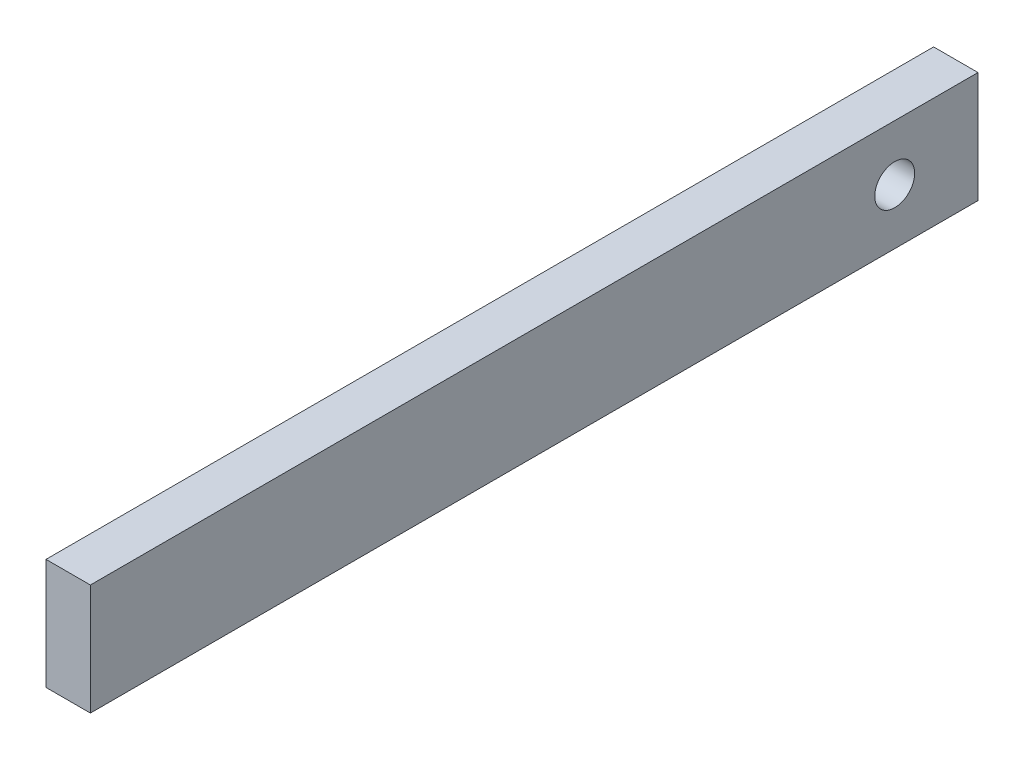
ISO-10303-21;
HEADER;
FILE_DESCRIPTION(('STEP AP214'),'2;1');
FILE_NAME('part.step','',(''),(''),'','','');
FILE_SCHEMA(('AUTOMOTIVE_DESIGN { 1 0 10303 214 1 1 1 1 }'));
ENDSEC;
DATA;
#1=APPLICATION_CONTEXT('core data for automotive mechanical design processes');
#2=APPLICATION_PROTOCOL_DEFINITION('international standard','automotive_design',2000,#1);
#3=PRODUCT_CONTEXT('',#1,'mechanical');
#4=PRODUCT('Part','Part','',(#3));
#5=PRODUCT_RELATED_PRODUCT_CATEGORY('part','',(#4));
#6=PRODUCT_DEFINITION_FORMATION('','',#4);
#7=PRODUCT_DEFINITION_CONTEXT('part definition',#1,'design');
#8=PRODUCT_DEFINITION('design','',#6,#7);
#9=PRODUCT_DEFINITION_SHAPE('','',#8);
#10=(LENGTH_UNIT() NAMED_UNIT(*) SI_UNIT(.MILLI.,.METRE.));
#11=(NAMED_UNIT(*) PLANE_ANGLE_UNIT() SI_UNIT($,.RADIAN.));
#12=(NAMED_UNIT(*) SI_UNIT($,.STERADIAN.) SOLID_ANGLE_UNIT());
#13=UNCERTAINTY_MEASURE_WITH_UNIT(LENGTH_MEASURE(1.E-05),#10,'distance_accuracy_value','');
#14=(GEOMETRIC_REPRESENTATION_CONTEXT(3) GLOBAL_UNCERTAINTY_ASSIGNED_CONTEXT((#13)) GLOBAL_UNIT_ASSIGNED_CONTEXT((#10,
#11,#12)) REPRESENTATION_CONTEXT('',''));
#15=CARTESIAN_POINT('',(0.,0.,0.));
#16=DIRECTION('',(0.,0.,1.));
#17=DIRECTION('',(1.,0.,0.));
#18=AXIS2_PLACEMENT_3D('',#15,#16,#17);
#19=CARTESIAN_POINT('',(20.,0.,0.));
#20=DIRECTION('',(1.,0.,0.));
#21=DIRECTION('',(0.,0.,-1.));
#22=AXIS2_PLACEMENT_3D('',#19,#20,#21);
#23=PLANE('',#22);
#24=DIRECTION('',(0.,-1.,0.));
#25=VECTOR('',#24,1.);
#26=CARTESIAN_POINT('',(20.,51.0263929618768,171.625302136374));
#27=LINE('',#26,#25);
#28=CARTESIAN_POINT('',(20.,51.0263929618768,171.625302136374));
#29=VERTEX_POINT('',#28);
#30=CARTESIAN_POINT('',(20.,1.02639296187682,171.625302136374));
#31=VERTEX_POINT('',#30);
#32=EDGE_CURVE('E91',#29,#31,#27,.T.);
#33=ORIENTED_EDGE('',*,*,#32,.T.);
#34=DIRECTION('',(0.,0.,-1.));
#35=VECTOR('',#34,1.);
#36=CARTESIAN_POINT('',(20.,1.02639296187682,171.625302136374));
#37=LINE('',#36,#35);
#38=CARTESIAN_POINT('',(20.,1.02639296187682,-228.374697863626));
#39=VERTEX_POINT('',#38);
#40=EDGE_CURVE('E86',#31,#39,#37,.T.);
#41=ORIENTED_EDGE('',*,*,#40,.T.);
#42=DIRECTION('',(0.,1.,0.));
#43=VECTOR('',#42,1.);
#44=CARTESIAN_POINT('',(20.,51.0263929618768,-228.374697863626));
#45=LINE('',#44,#43);
#46=CARTESIAN_POINT('',(20.,51.0263929618768,-228.374697863626));
#47=VERTEX_POINT('',#46);
#48=EDGE_CURVE('E89',#39,#47,#45,.T.);
#49=ORIENTED_EDGE('',*,*,#48,.T.);
#50=DIRECTION('',(0.,0.,1.));
#51=VECTOR('',#50,1.);
#52=CARTESIAN_POINT('',(20.,51.0263929618768,171.625302136374));
#53=LINE('',#52,#51);
#54=EDGE_CURVE('E56',#47,#29,#53,.T.);
#55=ORIENTED_EDGE('',*,*,#54,.T.);
#56=EDGE_LOOP('',(#33,#41,#49,#55));
#57=FACE_BOUND('',#56,.T.);
#58=CARTESIAN_POINT('',(20.,26.0263929618768,-190.83804097213));
#59=DIRECTION('',(1.,0.,0.));
#60=DIRECTION('',(0.,0.,-1.));
#61=AXIS2_PLACEMENT_3D('',#58,#59,#60);
#62=CIRCLE('',#61,9.00000000000001);
#63=CARTESIAN_POINT('',(20.,26.0263929618768,-199.83804097213));
#64=VERTEX_POINT('',#63);
#65=EDGE_CURVE('E106',#64,#64,#62,.T.);
#66=ORIENTED_EDGE('',*,*,#65,.F.);
#67=EDGE_LOOP('',(#66));
#68=FACE_BOUND('',#67,.T.);
#69=ADVANCED_FACE('F39',(#57,#68),#23,.T.);
#70=CARTESIAN_POINT('',(0.,0.,0.));
#71=DIRECTION('',(1.,0.,0.));
#72=DIRECTION('',(0.,0.,-1.));
#73=AXIS2_PLACEMENT_3D('',#70,#71,#72);
#74=PLANE('',#73);
#75=DIRECTION('',(0.,-1.,0.));
#76=VECTOR('',#75,1.);
#77=CARTESIAN_POINT('',(0.,51.0263929618768,171.625302136374));
#78=LINE('',#77,#76);
#79=CARTESIAN_POINT('',(0.,51.0263929618768,171.625302136374));
#80=VERTEX_POINT('',#79);
#81=CARTESIAN_POINT('',(0.,1.02639296187682,171.625302136374));
#82=VERTEX_POINT('',#81);
#83=EDGE_CURVE('E103',#80,#82,#78,.T.);
#84=ORIENTED_EDGE('',*,*,#83,.F.);
#85=DIRECTION('',(0.,0.,1.));
#86=VECTOR('',#85,1.);
#87=CARTESIAN_POINT('',(0.,51.0263929618768,171.625302136374));
#88=LINE('',#87,#86);
#89=CARTESIAN_POINT('',(0.,51.0263929618768,-228.374697863626));
#90=VERTEX_POINT('',#89);
#91=EDGE_CURVE('E79',#90,#80,#88,.T.);
#92=ORIENTED_EDGE('',*,*,#91,.F.);
#93=DIRECTION('',(0.,1.,0.));
#94=VECTOR('',#93,1.);
#95=CARTESIAN_POINT('',(0.,51.0263929618768,-228.374697863626));
#96=LINE('',#95,#94);
#97=CARTESIAN_POINT('',(0.,1.02639296187682,-228.374697863626));
#98=VERTEX_POINT('',#97);
#99=EDGE_CURVE('E73',#98,#90,#96,.T.);
#100=ORIENTED_EDGE('',*,*,#99,.F.);
#101=DIRECTION('',(0.,0.,-1.));
#102=VECTOR('',#101,1.);
#103=CARTESIAN_POINT('',(0.,1.02639296187682,171.625302136374));
#104=LINE('',#103,#102);
#105=EDGE_CURVE('E95',#82,#98,#104,.T.);
#106=ORIENTED_EDGE('',*,*,#105,.F.);
#107=EDGE_LOOP('',(#84,#92,#100,#106));
#108=FACE_BOUND('',#107,.T.);
#109=CARTESIAN_POINT('',(0.,26.0263929618768,-190.83804097213));
#110=DIRECTION('',(1.,0.,0.));
#111=DIRECTION('',(0.,0.,-1.));
#112=AXIS2_PLACEMENT_3D('',#109,#110,#111);
#113=CIRCLE('',#112,9.00000000000001);
#114=CARTESIAN_POINT('',(0.,26.0263929618768,-199.83804097213));
#115=VERTEX_POINT('',#114);
#116=EDGE_CURVE('E118',#115,#115,#113,.T.);
#117=ORIENTED_EDGE('',*,*,#116,.T.);
#118=EDGE_LOOP('',(#117));
#119=FACE_BOUND('',#118,.T.);
#120=ADVANCED_FACE('F114',(#108,#119),#74,.F.);
#121=CARTESIAN_POINT('',(20.,51.0263929618768,171.625302136374));
#122=DIRECTION('',(0.,0.,-1.));
#123=DIRECTION('',(-1.,0.,0.));
#124=AXIS2_PLACEMENT_3D('',#121,#122,#123);
#125=PLANE('',#124);
#126=ORIENTED_EDGE('',*,*,#83,.T.);
#127=DIRECTION('',(-1.,0.,0.));
#128=VECTOR('',#127,1.);
#129=CARTESIAN_POINT('',(20.,1.02639296187682,171.625302136374));
#130=LINE('',#129,#128);
#131=EDGE_CURVE('E11',#31,#82,#130,.T.);
#132=ORIENTED_EDGE('',*,*,#131,.F.);
#133=ORIENTED_EDGE('',*,*,#32,.F.);
#134=DIRECTION('',(-1.,0.,0.));
#135=VECTOR('',#134,1.);
#136=CARTESIAN_POINT('',(20.,51.0263929618768,171.625302136374));
#137=LINE('',#136,#135);
#138=EDGE_CURVE('E99',#29,#80,#137,.T.);
#139=ORIENTED_EDGE('',*,*,#138,.T.);
#140=EDGE_LOOP('',(#126,#132,#133,#139));
#141=FACE_BOUND('',#140,.T.);
#142=ADVANCED_FACE('F41',(#141),#125,.F.);
#143=CARTESIAN_POINT('',(20.,1.02639296187682,171.625302136374));
#144=DIRECTION('',(0.,1.,0.));
#145=DIRECTION('',(0.,0.,1.));
#146=AXIS2_PLACEMENT_3D('',#143,#144,#145);
#147=PLANE('',#146);
#148=ORIENTED_EDGE('',*,*,#105,.T.);
#149=DIRECTION('',(-1.,0.,0.));
#150=VECTOR('',#149,1.);
#151=CARTESIAN_POINT('',(20.,1.02639296187682,-228.374697863626));
#152=LINE('',#151,#150);
#153=EDGE_CURVE('E48',#39,#98,#152,.T.);
#154=ORIENTED_EDGE('',*,*,#153,.F.);
#155=ORIENTED_EDGE('',*,*,#40,.F.);
#156=ORIENTED_EDGE('',*,*,#131,.T.);
#157=EDGE_LOOP('',(#148,#154,#155,#156));
#158=FACE_BOUND('',#157,.T.);
#159=ADVANCED_FACE('F94',(#158),#147,.F.);
#160=CARTESIAN_POINT('',(20.,51.0263929618768,-228.374697863626));
#161=DIRECTION('',(0.,0.,1.));
#162=DIRECTION('',(0.,-1.,0.));
#163=AXIS2_PLACEMENT_3D('',#160,#161,#162);
#164=PLANE('',#163);
#165=ORIENTED_EDGE('',*,*,#99,.T.);
#166=DIRECTION('',(-1.,0.,0.));
#167=VECTOR('',#166,1.);
#168=CARTESIAN_POINT('',(20.,51.0263929618768,-228.374697863626));
#169=LINE('',#168,#167);
#170=EDGE_CURVE('E96',#47,#90,#169,.T.);
#171=ORIENTED_EDGE('',*,*,#170,.F.);
#172=ORIENTED_EDGE('',*,*,#48,.F.);
#173=ORIENTED_EDGE('',*,*,#153,.T.);
#174=EDGE_LOOP('',(#165,#171,#172,#173));
#175=FACE_BOUND('',#174,.T.);
#176=ADVANCED_FACE('F97',(#175),#164,.F.);
#177=CARTESIAN_POINT('',(20.,51.0263929618768,171.625302136374));
#178=DIRECTION('',(0.,-1.,0.));
#179=DIRECTION('',(0.,0.,-1.));
#180=AXIS2_PLACEMENT_3D('',#177,#178,#179);
#181=PLANE('',#180);
#182=ORIENTED_EDGE('',*,*,#91,.T.);
#183=ORIENTED_EDGE('',*,*,#138,.F.);
#184=ORIENTED_EDGE('',*,*,#54,.F.);
#185=ORIENTED_EDGE('',*,*,#170,.T.);
#186=EDGE_LOOP('',(#182,#183,#184,#185));
#187=FACE_BOUND('',#186,.T.);
#188=ADVANCED_FACE('F111',(#187),#181,.F.);
#189=CARTESIAN_POINT('',(20.,26.0263929618768,-190.83804097213));
#190=DIRECTION('',(-1.,0.,0.));
#191=DIRECTION('',(0.,0.,1.));
#192=AXIS2_PLACEMENT_3D('',#189,#190,#191);
#193=CYLINDRICAL_SURFACE('',#192,9.00000000000001);
#194=ORIENTED_EDGE('',*,*,#65,.T.);
#195=EDGE_LOOP('',(#194));
#196=FACE_BOUND('',#195,.T.);
#197=ORIENTED_EDGE('',*,*,#116,.F.);
#198=EDGE_LOOP('',(#197));
#199=FACE_BOUND('',#198,.T.);
#200=ADVANCED_FACE('F124',(#196,#199),#193,.F.);
#201=CLOSED_SHELL('',(#69,#120,#142,#159,#176,#188,#200));
#202=MANIFOLD_SOLID_BREP('B2',#201);
#203=ADVANCED_BREP_SHAPE_REPRESENTATION('',(#18,#202),#14);
#204=SHAPE_DEFINITION_REPRESENTATION(#9,#203);
ENDSEC;
END-ISO-10303-21;
